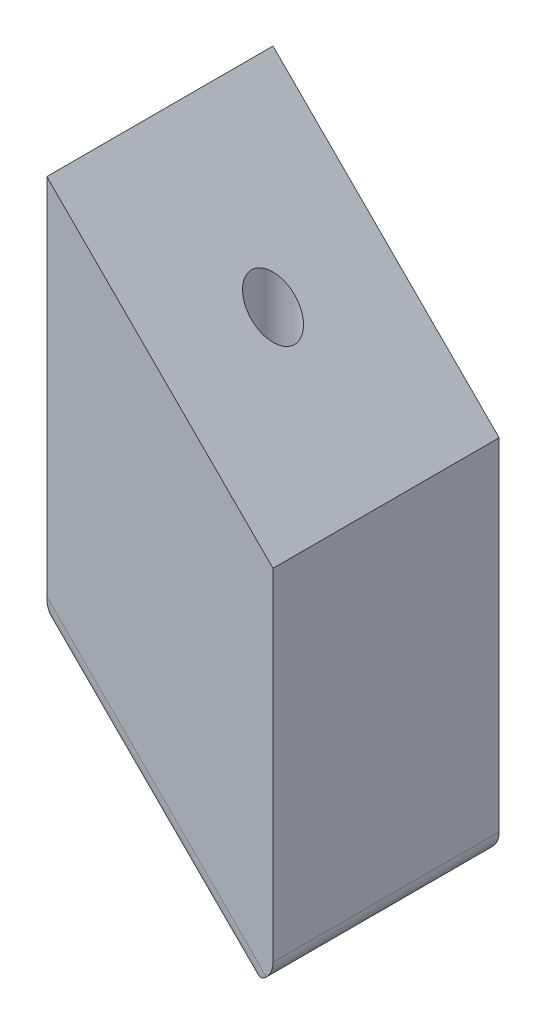
ISO-10303-21;
HEADER;
FILE_DESCRIPTION(('STEP AP214'),'2;1');
FILE_NAME('part.step','',(''),(''),'','','');
FILE_SCHEMA(('AUTOMOTIVE_DESIGN { 1 0 10303 214 1 1 1 1 }'));
ENDSEC;
DATA;
#1=APPLICATION_CONTEXT('core data for automotive mechanical design processes');
#2=APPLICATION_PROTOCOL_DEFINITION('international standard','automotive_design',2000,#1);
#3=PRODUCT_CONTEXT('',#1,'mechanical');
#4=PRODUCT('Part','Part','',(#3));
#5=PRODUCT_RELATED_PRODUCT_CATEGORY('part','',(#4));
#6=PRODUCT_DEFINITION_FORMATION('','',#4);
#7=PRODUCT_DEFINITION_CONTEXT('part definition',#1,'design');
#8=PRODUCT_DEFINITION('design','',#6,#7);
#9=PRODUCT_DEFINITION_SHAPE('','',#8);
#10=(LENGTH_UNIT() NAMED_UNIT(*) SI_UNIT(.MILLI.,.METRE.));
#11=(NAMED_UNIT(*) PLANE_ANGLE_UNIT() SI_UNIT($,.RADIAN.));
#12=(NAMED_UNIT(*) SI_UNIT($,.STERADIAN.) SOLID_ANGLE_UNIT());
#13=UNCERTAINTY_MEASURE_WITH_UNIT(LENGTH_MEASURE(1.E-05),#10,'distance_accuracy_value','');
#14=(GEOMETRIC_REPRESENTATION_CONTEXT(3) GLOBAL_UNCERTAINTY_ASSIGNED_CONTEXT((#13)) GLOBAL_UNIT_ASSIGNED_CONTEXT((#10,
#11,#12)) REPRESENTATION_CONTEXT('',''));
#15=CARTESIAN_POINT('',(0.,0.,0.));
#16=DIRECTION('',(0.,0.,1.));
#17=DIRECTION('',(1.,0.,0.));
#18=AXIS2_PLACEMENT_3D('',#15,#16,#17);
#19=CARTESIAN_POINT('',(5.,-15.,10.));
#20=DIRECTION('',(1.,0.,0.));
#21=DIRECTION('',(0.,1.,0.));
#22=AXIS2_PLACEMENT_3D('',#19,#20,#21);
#23=PLANE('',#22);
#24=DIRECTION('',(0.,-1.,0.));
#25=VECTOR('',#24,1.);
#26=CARTESIAN_POINT('',(5.,-5.,-6.));
#27=LINE('',#26,#25);
#28=CARTESIAN_POINT('',(5.,-5.,-6.));
#29=VERTEX_POINT('',#28);
#30=CARTESIAN_POINT('',(5.,-15.,-6.));
#31=VERTEX_POINT('',#30);
#32=EDGE_CURVE('E140',#29,#31,#27,.T.);
#33=ORIENTED_EDGE('',*,*,#32,.T.);
#34=DIRECTION('',(0.,0.,-1.));
#35=VECTOR('',#34,1.);
#36=CARTESIAN_POINT('',(5.,-15.,10.));
#37=LINE('',#36,#35);
#38=CARTESIAN_POINT('',(5.,-15.,6.));
#39=VERTEX_POINT('',#38);
#40=EDGE_CURVE('E151',#39,#31,#37,.T.);
#41=ORIENTED_EDGE('',*,*,#40,.F.);
#42=DIRECTION('',(0.,1.,0.));
#43=VECTOR('',#42,1.);
#44=CARTESIAN_POINT('',(5.,-5.,6.));
#45=LINE('',#44,#43);
#46=CARTESIAN_POINT('',(5.,-5.,6.));
#47=VERTEX_POINT('',#46);
#48=EDGE_CURVE('E125',#39,#47,#45,.T.);
#49=ORIENTED_EDGE('',*,*,#48,.T.);
#50=DIRECTION('',(0.,0.,-1.));
#51=VECTOR('',#50,1.);
#52=CARTESIAN_POINT('',(5.,-5.,10.));
#53=LINE('',#52,#51);
#54=EDGE_CURVE('E138',#47,#29,#53,.T.);
#55=ORIENTED_EDGE('',*,*,#54,.T.);
#56=EDGE_LOOP('',(#33,#41,#49,#55));
#57=FACE_BOUND('',#56,.T.);
#58=ADVANCED_FACE('F39',(#57),#23,.F.);
#59=CARTESIAN_POINT('',(5.,-5.,10.));
#60=DIRECTION('',(0.,1.,0.));
#61=DIRECTION('',(-1.,0.,0.));
#62=AXIS2_PLACEMENT_3D('',#59,#60,#61);
#63=PLANE('',#62);
#64=CARTESIAN_POINT('',(0.,-5.,0.));
#65=DIRECTION('',(0.,-1.,0.));
#66=DIRECTION('',(1.,0.,0.));
#67=AXIS2_PLACEMENT_3D('',#64,#65,#66);
#68=CIRCLE('',#67,1.905);
#69=CARTESIAN_POINT('',(1.905,-5.,0.));
#70=VERTEX_POINT('',#69);
#71=EDGE_CURVE('E154',#70,#70,#68,.T.);
#72=ORIENTED_EDGE('',*,*,#71,.F.);
#73=EDGE_LOOP('',(#72));
#74=FACE_BOUND('',#73,.T.);
#75=DIRECTION('',(1.,0.,0.));
#76=VECTOR('',#75,1.);
#77=CARTESIAN_POINT('',(-5.,-5.,-6.));
#78=LINE('',#77,#76);
#79=CARTESIAN_POINT('',(-5.,-5.,-6.));
#80=VERTEX_POINT('',#79);
#81=EDGE_CURVE('E241',#80,#29,#78,.T.);
#82=ORIENTED_EDGE('',*,*,#81,.T.);
#83=ORIENTED_EDGE('',*,*,#54,.F.);
#84=DIRECTION('',(-1.,0.,0.));
#85=VECTOR('',#84,1.);
#86=CARTESIAN_POINT('',(-5.,-5.,6.));
#87=LINE('',#86,#85);
#88=CARTESIAN_POINT('',(-5.,-5.,6.));
#89=VERTEX_POINT('',#88);
#90=EDGE_CURVE('E123',#47,#89,#87,.T.);
#91=ORIENTED_EDGE('',*,*,#90,.T.);
#92=DIRECTION('',(0.,0.,-1.));
#93=VECTOR('',#92,1.);
#94=CARTESIAN_POINT('',(-5.,-5.,10.));
#95=LINE('',#94,#93);
#96=EDGE_CURVE('E135',#89,#80,#95,.T.);
#97=ORIENTED_EDGE('',*,*,#96,.T.);
#98=EDGE_LOOP('',(#82,#83,#91,#97));
#99=FACE_BOUND('',#98,.T.);
#100=ADVANCED_FACE('F134',(#74,#99),#63,.F.);
#101=CARTESIAN_POINT('',(10.,15.,10.));
#102=DIRECTION('',(-1.,0.,0.));
#103=DIRECTION('',(0.,0.,1.));
#104=AXIS2_PLACEMENT_3D('',#101,#102,#103);
#105=PLANE('',#104);
#106=DIRECTION('',(0.,-1.,0.));
#107=VECTOR('',#106,1.);
#108=CARTESIAN_POINT('',(10.,15.,10.));
#109=LINE('',#108,#107);
#110=CARTESIAN_POINT('',(10.,15.,10.));
#111=VERTEX_POINT('',#110);
#112=CARTESIAN_POINT('',(10.,-15.1715728752538,10.));
#113=VERTEX_POINT('',#112);
#114=EDGE_CURVE('E174',#111,#113,#109,.T.);
#115=ORIENTED_EDGE('',*,*,#114,.T.);
#116=DIRECTION('',(0.,0.,1.));
#117=VECTOR('',#116,1.);
#118=CARTESIAN_POINT('',(10.,-15.1715728752538,-10.));
#119=LINE('',#118,#117);
#120=CARTESIAN_POINT('',(10.,-15.1715728752538,-10.));
#121=VERTEX_POINT('',#120);
#122=EDGE_CURVE('E208',#113,#121,#119,.F.);
#123=ORIENTED_EDGE('',*,*,#122,.T.);
#124=DIRECTION('',(0.,-1.,0.));
#125=VECTOR('',#124,1.);
#126=CARTESIAN_POINT('',(10.,15.,-10.));
#127=LINE('',#126,#125);
#128=CARTESIAN_POINT('',(10.,15.,-10.));
#129=VERTEX_POINT('',#128);
#130=EDGE_CURVE('E185',#129,#121,#127,.T.);
#131=ORIENTED_EDGE('',*,*,#130,.F.);
#132=DIRECTION('',(0.,0.,-1.));
#133=VECTOR('',#132,1.);
#134=CARTESIAN_POINT('',(10.,15.,10.));
#135=LINE('',#134,#133);
#136=EDGE_CURVE('E170',#111,#129,#135,.T.);
#137=ORIENTED_EDGE('',*,*,#136,.F.);
#138=EDGE_LOOP('',(#115,#123,#131,#137));
#139=FACE_BOUND('',#138,.T.);
#140=ADVANCED_FACE('F262',(#139),#105,.F.);
#141=CARTESIAN_POINT('',(-10.,15.,-10.));
#142=DIRECTION('',(0.,0.,1.));
#143=DIRECTION('',(1.,0.,0.));
#144=AXIS2_PLACEMENT_3D('',#141,#142,#143);
#145=PLANE('',#144);
#146=ORIENTED_EDGE('',*,*,#130,.T.);
#147=CARTESIAN_POINT('',(8.,-15.1715728752538,-10.));
#148=DIRECTION('',(0.,0.,1.));
#149=DIRECTION('',(1.,0.,0.));
#150=AXIS2_PLACEMENT_3D('',#147,#148,#149);
#151=CIRCLE('',#150,2.);
#152=CARTESIAN_POINT('',(9.4142135623731,-16.5857864376269,-10.));
#153=VERTEX_POINT('',#152);
#154=EDGE_CURVE('E215',#121,#153,#151,.F.);
#155=ORIENTED_EDGE('',*,*,#154,.T.);
#156=DIRECTION('',(-0.707106781186548,0.707106781186548,0.));
#157=VECTOR('',#156,1.);
#158=CARTESIAN_POINT('',(-8.5857864376269,1.4142135623731,-10.));
#159=LINE('',#158,#157);
#160=CARTESIAN_POINT('',(-10.,2.82842712474619,-10.));
#161=VERTEX_POINT('',#160);
#162=EDGE_CURVE('E212',#153,#161,#159,.T.);
#163=ORIENTED_EDGE('',*,*,#162,.T.);
#164=DIRECTION('',(0.,-1.,0.));
#165=VECTOR('',#164,1.);
#166=CARTESIAN_POINT('',(-10.,15.,-10.));
#167=LINE('',#166,#165);
#168=CARTESIAN_POINT('',(-10.,35.,-10.));
#169=VERTEX_POINT('',#168);
#170=EDGE_CURVE('E182',#169,#161,#167,.T.);
#171=ORIENTED_EDGE('',*,*,#170,.F.);
#172=DIRECTION('',(0.707106781186548,-0.707106781186548,0.));
#173=VECTOR('',#172,1.);
#174=CARTESIAN_POINT('',(10.,15.,-10.));
#175=LINE('',#174,#173);
#176=EDGE_CURVE('E166',#169,#129,#175,.T.);
#177=ORIENTED_EDGE('',*,*,#176,.T.);
#178=EDGE_LOOP('',(#146,#155,#163,#171,#177));
#179=FACE_BOUND('',#178,.T.);
#180=ADVANCED_FACE('F283',(#179),#145,.F.);
#181=CARTESIAN_POINT('',(-10.,15.,10.));
#182=DIRECTION('',(1.,0.,0.));
#183=DIRECTION('',(0.,0.,-1.));
#184=AXIS2_PLACEMENT_3D('',#181,#182,#183);
#185=PLANE('',#184);
#186=ORIENTED_EDGE('',*,*,#170,.T.);
#187=CARTESIAN_POINT('',(-10.,2.82842712474619,-8.));
#188=DIRECTION('',(1.,0.,0.));
#189=DIRECTION('',(0.,-1.,0.));
#190=AXIS2_PLACEMENT_3D('',#187,#188,#189);
#191=ELLIPSE('',#190,2.82842712474619,2.);
#192=CARTESIAN_POINT('',(-10.,0.828427124746192,-9.4142135623731));
#193=VERTEX_POINT('',#192);
#194=EDGE_CURVE('E11',#161,#193,#191,.F.);
#195=ORIENTED_EDGE('',*,*,#194,.T.);
#196=DIRECTION('',(0.,0.,1.));
#197=VECTOR('',#196,1.);
#198=CARTESIAN_POINT('',(-10.,0.828427124746192,10.));
#199=LINE('',#198,#197);
#200=CARTESIAN_POINT('',(-10.,0.828427124746192,9.41421356237309));
#201=VERTEX_POINT('',#200);
#202=EDGE_CURVE('E49',#193,#201,#199,.T.);
#203=ORIENTED_EDGE('',*,*,#202,.T.);
#204=CARTESIAN_POINT('',(-10.,2.82842712474619,8.));
#205=DIRECTION('',(1.,0.,0.));
#206=DIRECTION('',(0.,1.,0.));
#207=AXIS2_PLACEMENT_3D('',#204,#205,#206);
#208=ELLIPSE('',#207,2.82842712474619,2.);
#209=CARTESIAN_POINT('',(-10.,2.82842712474619,10.));
#210=VERTEX_POINT('',#209);
#211=EDGE_CURVE('E218',#201,#210,#208,.F.);
#212=ORIENTED_EDGE('',*,*,#211,.T.);
#213=DIRECTION('',(0.,-1.,0.));
#214=VECTOR('',#213,1.);
#215=CARTESIAN_POINT('',(-10.,15.,10.));
#216=LINE('',#215,#214);
#217=CARTESIAN_POINT('',(-10.,35.,10.));
#218=VERTEX_POINT('',#217);
#219=EDGE_CURVE('E178',#218,#210,#216,.T.);
#220=ORIENTED_EDGE('',*,*,#219,.F.);
#221=DIRECTION('',(0.,0.,1.));
#222=VECTOR('',#221,1.);
#223=CARTESIAN_POINT('',(-10.,35.,-38.2842712474619));
#224=LINE('',#223,#222);
#225=EDGE_CURVE('E162',#169,#218,#224,.T.);
#226=ORIENTED_EDGE('',*,*,#225,.F.);
#227=EDGE_LOOP('',(#186,#195,#203,#212,#220,#226));
#228=FACE_BOUND('',#227,.T.);
#229=ADVANCED_FACE('F279',(#228),#185,.F.);
#230=CARTESIAN_POINT('',(-10.,15.,10.));
#231=DIRECTION('',(0.,0.,-1.));
#232=DIRECTION('',(-1.,0.,0.));
#233=AXIS2_PLACEMENT_3D('',#230,#231,#232);
#234=PLANE('',#233);
#235=DIRECTION('',(0.707106781186548,-0.707106781186548,0.));
#236=VECTOR('',#235,1.);
#237=CARTESIAN_POINT('',(11.4142135623731,-18.5857864376269,10.));
#238=LINE('',#237,#236);
#239=CARTESIAN_POINT('',(9.4142135623731,-16.5857864376269,10.));
#240=VERTEX_POINT('',#239);
#241=EDGE_CURVE('E202',#210,#240,#238,.T.);
#242=ORIENTED_EDGE('',*,*,#241,.T.);
#243=CARTESIAN_POINT('',(8.,-15.1715728752538,9.99999999999999));
#244=DIRECTION('',(0.,0.,-1.));
#245=DIRECTION('',(-1.,0.,0.));
#246=AXIS2_PLACEMENT_3D('',#243,#244,#245);
#247=CIRCLE('',#246,2.);
#248=EDGE_CURVE('E205',#240,#113,#247,.F.);
#249=ORIENTED_EDGE('',*,*,#248,.T.);
#250=ORIENTED_EDGE('',*,*,#114,.F.);
#251=DIRECTION('',(-0.707106781186548,0.707106781186548,0.));
#252=VECTOR('',#251,1.);
#253=CARTESIAN_POINT('',(10.,15.,10.));
#254=LINE('',#253,#252);
#255=EDGE_CURVE('E158',#111,#218,#254,.T.);
#256=ORIENTED_EDGE('',*,*,#255,.T.);
#257=ORIENTED_EDGE('',*,*,#219,.T.);
#258=EDGE_LOOP('',(#242,#249,#250,#256,#257));
#259=FACE_BOUND('',#258,.T.);
#260=ADVANCED_FACE('F275',(#259),#234,.F.);
#261=CARTESIAN_POINT('',(10.,15.,-38.2842712474619));
#262=DIRECTION('',(0.707106781186547,0.707106781186547,0.));
#263=DIRECTION('',(-0.707106781186548,0.707106781186548,0.));
#264=AXIS2_PLACEMENT_3D('',#261,#262,#263);
#265=PLANE('',#264);
#266=CARTESIAN_POINT('',(0.,25.,0.));
#267=DIRECTION('',(0.707106781186547,0.707106781186547,0.));
#268=DIRECTION('',(0.707106781186548,-0.707106781186548,0.));
#269=AXIS2_PLACEMENT_3D('',#266,#267,#268);
#270=ELLIPSE('',#269,2.69407683632075,1.905);
#271=CARTESIAN_POINT('',(1.905,23.095,0.));
#272=VERTEX_POINT('',#271);
#273=EDGE_CURVE('E147',#272,#272,#270,.T.);
#274=ORIENTED_EDGE('',*,*,#273,.F.);
#275=EDGE_LOOP('',(#274));
#276=FACE_BOUND('',#275,.T.);
#277=ORIENTED_EDGE('',*,*,#176,.F.);
#278=ORIENTED_EDGE('',*,*,#225,.T.);
#279=ORIENTED_EDGE('',*,*,#255,.F.);
#280=ORIENTED_EDGE('',*,*,#136,.T.);
#281=EDGE_LOOP('',(#277,#278,#279,#280));
#282=FACE_BOUND('',#281,.T.);
#283=ADVANCED_FACE('F271',(#276,#282),#265,.T.);
#284=CARTESIAN_POINT('',(-10.,0.,-38.2842712474619));
#285=DIRECTION('',(-0.707106781186547,-0.707106781186547,0.));
#286=DIRECTION('',(0.707106781186548,-0.707106781186548,0.));
#287=AXIS2_PLACEMENT_3D('',#284,#285,#286);
#288=PLANE('',#287);
#289=DIRECTION('',(-0.707106781186548,0.707106781186548,0.));
#290=VECTOR('',#289,1.);
#291=CARTESIAN_POINT('',(10.,-20.,-8.));
#292=LINE('',#291,#290);
#293=CARTESIAN_POINT('',(-9.4142135623731,-0.585786437626904,-8.));
#294=VERTEX_POINT('',#293);
#295=CARTESIAN_POINT('',(6.5857864376269,-16.5857864376269,-8.));
#296=VERTEX_POINT('',#295);
#297=EDGE_CURVE('E195',#294,#296,#292,.F.);
#298=ORIENTED_EDGE('',*,*,#297,.T.);
#299=DIRECTION('',(0.,0.,1.));
#300=VECTOR('',#299,1.);
#301=CARTESIAN_POINT('',(6.5857864376269,-16.5857864376269,9.99999999999999));
#302=LINE('',#301,#300);
#303=CARTESIAN_POINT('',(6.5857864376269,-16.5857864376269,8.));
#304=VERTEX_POINT('',#303);
#305=EDGE_CURVE('E198',#296,#304,#302,.T.);
#306=ORIENTED_EDGE('',*,*,#305,.T.);
#307=DIRECTION('',(0.707106781186548,-0.707106781186548,0.));
#308=VECTOR('',#307,1.);
#309=CARTESIAN_POINT('',(-10.,0.,8.));
#310=LINE('',#309,#308);
#311=CARTESIAN_POINT('',(-9.4142135623731,-0.585786437626905,8.));
#312=VERTEX_POINT('',#311);
#313=EDGE_CURVE('E189',#304,#312,#310,.F.);
#314=ORIENTED_EDGE('',*,*,#313,.T.);
#315=DIRECTION('',(0.,0.,1.));
#316=VECTOR('',#315,1.);
#317=CARTESIAN_POINT('',(-9.4142135623731,-0.585786437626904,-10.));
#318=LINE('',#317,#316);
#319=EDGE_CURVE('E192',#312,#294,#318,.F.);
#320=ORIENTED_EDGE('',*,*,#319,.T.);
#321=EDGE_LOOP('',(#298,#306,#314,#320));
#322=FACE_BOUND('',#321,.T.);
#323=ORIENTED_EDGE('',*,*,#96,.F.);
#324=DIRECTION('',(0.707106781186548,-0.707106781186547,0.));
#325=VECTOR('',#324,1.);
#326=CARTESIAN_POINT('',(5.,-15.,6.));
#327=LINE('',#326,#325);
#328=EDGE_CURVE('E120',#89,#39,#327,.T.);
#329=ORIENTED_EDGE('',*,*,#328,.T.);
#330=ORIENTED_EDGE('',*,*,#40,.T.);
#331=DIRECTION('',(-0.707106781186548,0.707106781186547,0.));
#332=VECTOR('',#331,1.);
#333=CARTESIAN_POINT('',(5.,-15.,-6.));
#334=LINE('',#333,#332);
#335=EDGE_CURVE('E145',#31,#80,#334,.T.);
#336=ORIENTED_EDGE('',*,*,#335,.T.);
#337=EDGE_LOOP('',(#323,#329,#330,#336));
#338=FACE_BOUND('',#337,.T.);
#339=ADVANCED_FACE('F143',(#322,#338),#288,.T.);
#340=CARTESIAN_POINT('',(0.,35.,0.));
#341=DIRECTION('',(0.,-1.,0.));
#342=DIRECTION('',(1.,0.,0.));
#343=AXIS2_PLACEMENT_3D('',#340,#341,#342);
#344=CYLINDRICAL_SURFACE('',#343,1.905);
#345=ORIENTED_EDGE('',*,*,#273,.T.);
#346=EDGE_LOOP('',(#345));
#347=FACE_BOUND('',#346,.T.);
#348=ORIENTED_EDGE('',*,*,#71,.T.);
#349=EDGE_LOOP('',(#348));
#350=FACE_BOUND('',#349,.T.);
#351=ADVANCED_FACE('F266',(#347,#350),#344,.F.);
#352=CARTESIAN_POINT('',(0.,0.,6.));
#353=DIRECTION('',(0.,0.,-1.));
#354=DIRECTION('',(-1.,0.,0.));
#355=AXIS2_PLACEMENT_3D('',#352,#353,#354);
#356=PLANE('',#355);
#357=ORIENTED_EDGE('',*,*,#90,.F.);
#358=ORIENTED_EDGE('',*,*,#48,.F.);
#359=ORIENTED_EDGE('',*,*,#328,.F.);
#360=EDGE_LOOP('',(#357,#358,#359));
#361=FACE_BOUND('',#360,.T.);
#362=ADVANCED_FACE('F122',(#361),#356,.T.);
#363=CARTESIAN_POINT('',(0.,0.,-6.));
#364=DIRECTION('',(0.,0.,-1.));
#365=DIRECTION('',(-1.,0.,0.));
#366=AXIS2_PLACEMENT_3D('',#363,#364,#365);
#367=PLANE('',#366);
#368=ORIENTED_EDGE('',*,*,#335,.F.);
#369=ORIENTED_EDGE('',*,*,#32,.F.);
#370=ORIENTED_EDGE('',*,*,#81,.F.);
#371=EDGE_LOOP('',(#368,#369,#370));
#372=FACE_BOUND('',#371,.T.);
#373=ADVANCED_FACE('F256',(#372),#367,.F.);
#374=CARTESIAN_POINT('',(-8.,0.828427124746192,10.));
#375=DIRECTION('',(0.,0.,-1.));
#376=DIRECTION('',(-1.,0.,0.));
#377=AXIS2_PLACEMENT_3D('',#374,#375,#376);
#378=CYLINDRICAL_SURFACE('',#377,2.);
#379=CARTESIAN_POINT('',(-8.,0.828427124746192,8.));
#380=DIRECTION('',(-0.5,0.5,-0.707106781186547));
#381=DIRECTION('',(-0.5,0.5,0.707106781186547));
#382=AXIS2_PLACEMENT_3D('',#379,#380,#381);
#383=ELLIPSE('',#382,2.82842712474619,2.);
#384=EDGE_CURVE('E229',#201,#312,#383,.F.);
#385=ORIENTED_EDGE('',*,*,#384,.F.);
#386=ORIENTED_EDGE('',*,*,#202,.F.);
#387=CARTESIAN_POINT('',(-8.,0.828427124746191,-8.));
#388=DIRECTION('',(0.5,-0.5,-0.707106781186547));
#389=DIRECTION('',(-0.5,0.5,-0.707106781186547));
#390=AXIS2_PLACEMENT_3D('',#387,#388,#389);
#391=ELLIPSE('',#390,2.82842712474619,2.);
#392=EDGE_CURVE('E43',#294,#193,#391,.T.);
#393=ORIENTED_EDGE('',*,*,#392,.F.);
#394=ORIENTED_EDGE('',*,*,#319,.F.);
#395=EDGE_LOOP('',(#385,#386,#393,#394));
#396=FACE_BOUND('',#395,.T.);
#397=ADVANCED_FACE('F41',(#396),#378,.T.);
#398=CARTESIAN_POINT('',(-16.0857864376269,8.9142135623731,-8.));
#399=DIRECTION('',(0.707106781186548,-0.707106781186548,0.));
#400=DIRECTION('',(0.707106781186548,0.707106781186548,0.));
#401=AXIS2_PLACEMENT_3D('',#398,#399,#400);
#402=CYLINDRICAL_SURFACE('',#401,2.);
#403=ORIENTED_EDGE('',*,*,#194,.F.);
#404=ORIENTED_EDGE('',*,*,#162,.F.);
#405=CARTESIAN_POINT('',(8.,-15.1715728752538,-8.));
#406=DIRECTION('',(0.5,-0.5,0.707106781186547));
#407=DIRECTION('',(0.5,-0.5,-0.707106781186547));
#408=AXIS2_PLACEMENT_3D('',#405,#406,#407);
#409=ELLIPSE('',#408,2.82842712474619,2.);
#410=EDGE_CURVE('E226',#296,#153,#409,.T.);
#411=ORIENTED_EDGE('',*,*,#410,.F.);
#412=ORIENTED_EDGE('',*,*,#297,.F.);
#413=ORIENTED_EDGE('',*,*,#392,.T.);
#414=EDGE_LOOP('',(#403,#404,#411,#412,#413));
#415=FACE_BOUND('',#414,.T.);
#416=ADVANCED_FACE('F296',(#415),#402,.T.);
#417=CARTESIAN_POINT('',(-16.0857864376269,8.9142135623731,8.));
#418=DIRECTION('',(-0.707106781186548,0.707106781186548,0.));
#419=DIRECTION('',(-0.707106781186548,-0.707106781186548,0.));
#420=AXIS2_PLACEMENT_3D('',#417,#418,#419);
#421=CYLINDRICAL_SURFACE('',#420,2.);
#422=ORIENTED_EDGE('',*,*,#384,.T.);
#423=ORIENTED_EDGE('',*,*,#313,.F.);
#424=CARTESIAN_POINT('',(8.,-15.1715728752538,8.));
#425=DIRECTION('',(-0.5,0.5,0.707106781186547));
#426=DIRECTION('',(-0.5,0.5,-0.707106781186547));
#427=AXIS2_PLACEMENT_3D('',#424,#425,#426);
#428=ELLIPSE('',#427,2.82842712474619,2.);
#429=EDGE_CURVE('E223',#240,#304,#428,.F.);
#430=ORIENTED_EDGE('',*,*,#429,.F.);
#431=ORIENTED_EDGE('',*,*,#241,.F.);
#432=ORIENTED_EDGE('',*,*,#211,.F.);
#433=EDGE_LOOP('',(#422,#423,#430,#431,#432));
#434=FACE_BOUND('',#433,.T.);
#435=ADVANCED_FACE('F293',(#434),#421,.T.);
#436=CARTESIAN_POINT('',(8.,-15.1715728752538,-38.2842712474619));
#437=DIRECTION('',(0.,0.,-1.));
#438=DIRECTION('',(-1.,0.,0.));
#439=AXIS2_PLACEMENT_3D('',#436,#437,#438);
#440=CYLINDRICAL_SURFACE('',#439,2.);
#441=ORIENTED_EDGE('',*,*,#154,.F.);
#442=ORIENTED_EDGE('',*,*,#122,.F.);
#443=ORIENTED_EDGE('',*,*,#248,.F.);
#444=ORIENTED_EDGE('',*,*,#429,.T.);
#445=ORIENTED_EDGE('',*,*,#305,.F.);
#446=ORIENTED_EDGE('',*,*,#410,.T.);
#447=EDGE_LOOP('',(#441,#442,#443,#444,#445,#446));
#448=FACE_BOUND('',#447,.T.);
#449=ADVANCED_FACE('F290',(#448),#440,.T.);
#450=CLOSED_SHELL('',(#58,#100,#140,#180,#229,#260,#283,#339,#351,#362,#373,#397,#416,#435,#449));
#451=MANIFOLD_SOLID_BREP('B2',#450);
#452=ADVANCED_BREP_SHAPE_REPRESENTATION('',(#18,#451),#14);
#453=SHAPE_DEFINITION_REPRESENTATION(#9,#452);
ENDSEC;
END-ISO-10303-21;
